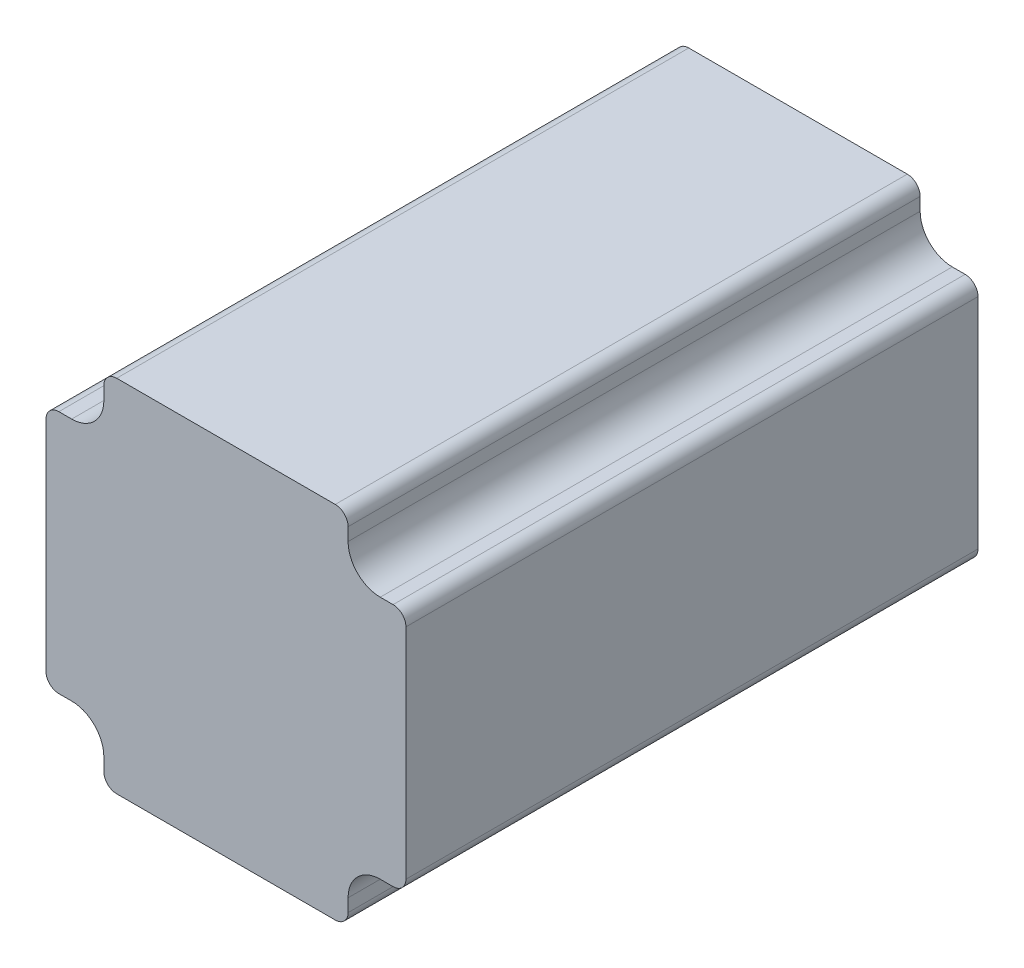
ISO-10303-21;
HEADER;
FILE_DESCRIPTION(('STEP AP214'),'2;1');
FILE_NAME('part.step','',(''),(''),'','','');
FILE_SCHEMA(('AUTOMOTIVE_DESIGN { 1 0 10303 214 1 1 1 1 }'));
ENDSEC;
DATA;
#1=APPLICATION_CONTEXT('core data for automotive mechanical design processes');
#2=APPLICATION_PROTOCOL_DEFINITION('international standard','automotive_design',2000,#1);
#3=PRODUCT_CONTEXT('',#1,'mechanical');
#4=PRODUCT('Part','Part','',(#3));
#5=PRODUCT_RELATED_PRODUCT_CATEGORY('part','',(#4));
#6=PRODUCT_DEFINITION_FORMATION('','',#4);
#7=PRODUCT_DEFINITION_CONTEXT('part definition',#1,'design');
#8=PRODUCT_DEFINITION('design','',#6,#7);
#9=PRODUCT_DEFINITION_SHAPE('','',#8);
#10=(LENGTH_UNIT() NAMED_UNIT(*) SI_UNIT(.MILLI.,.METRE.));
#11=(NAMED_UNIT(*) PLANE_ANGLE_UNIT() SI_UNIT($,.RADIAN.));
#12=(NAMED_UNIT(*) SI_UNIT($,.STERADIAN.) SOLID_ANGLE_UNIT());
#13=UNCERTAINTY_MEASURE_WITH_UNIT(LENGTH_MEASURE(1.E-05),#10,'distance_accuracy_value','');
#14=(GEOMETRIC_REPRESENTATION_CONTEXT(3) GLOBAL_UNCERTAINTY_ASSIGNED_CONTEXT((#13)) GLOBAL_UNIT_ASSIGNED_CONTEXT((#10,
#11,#12)) REPRESENTATION_CONTEXT('',''));
#15=CARTESIAN_POINT('',(0.,0.,0.));
#16=DIRECTION('',(0.,0.,1.));
#17=DIRECTION('',(1.,0.,0.));
#18=AXIS2_PLACEMENT_3D('',#15,#16,#17);
#19=CARTESIAN_POINT('',(-28.,-28.,89.));
#20=DIRECTION('',(1.,0.,0.));
#21=DIRECTION('',(0.,0.,-1.));
#22=AXIS2_PLACEMENT_3D('',#19,#20,#21);
#23=PLANE('',#22);
#24=DIRECTION('',(0.,-1.,0.));
#25=VECTOR('',#24,1.);
#26=CARTESIAN_POINT('',(-28.,-28.,0.));
#27=LINE('',#26,#25);
#28=CARTESIAN_POINT('',(-28.,16.9999999999999,0.));
#29=VERTEX_POINT('',#28);
#30=CARTESIAN_POINT('',(-28.,-17.,0.));
#31=VERTEX_POINT('',#30);
#32=EDGE_CURVE('E237',#29,#31,#27,.T.);
#33=ORIENTED_EDGE('',*,*,#32,.T.);
#34=DIRECTION('',(0.,0.,1.));
#35=VECTOR('',#34,1.);
#36=CARTESIAN_POINT('',(-28.,-17.,89.));
#37=LINE('',#36,#35);
#38=CARTESIAN_POINT('',(-28.,-17.,89.));
#39=VERTEX_POINT('',#38);
#40=EDGE_CURVE('E355',#31,#39,#37,.T.);
#41=ORIENTED_EDGE('',*,*,#40,.T.);
#42=DIRECTION('',(0.,-1.,0.));
#43=VECTOR('',#42,1.);
#44=CARTESIAN_POINT('',(-28.,-28.,89.));
#45=LINE('',#44,#43);
#46=CARTESIAN_POINT('',(-28.,16.9999999999999,89.));
#47=VERTEX_POINT('',#46);
#48=EDGE_CURVE('E242',#47,#39,#45,.T.);
#49=ORIENTED_EDGE('',*,*,#48,.F.);
#50=DIRECTION('',(0.,0.,1.));
#51=VECTOR('',#50,1.);
#52=CARTESIAN_POINT('',(-28.,16.9999999999999,89.));
#53=LINE('',#52,#51);
#54=EDGE_CURVE('E353',#47,#29,#53,.F.);
#55=ORIENTED_EDGE('',*,*,#54,.T.);
#56=EDGE_LOOP('',(#33,#41,#49,#55));
#57=FACE_BOUND('',#56,.T.);
#58=ADVANCED_FACE('F33',(#57),#23,.F.);
#59=CARTESIAN_POINT('',(28.,-28.,89.));
#60=DIRECTION('',(0.,1.,0.));
#61=DIRECTION('',(-1.,0.,0.));
#62=AXIS2_PLACEMENT_3D('',#59,#60,#61);
#63=PLANE('',#62);
#64=DIRECTION('',(1.,0.,0.));
#65=VECTOR('',#64,1.);
#66=CARTESIAN_POINT('',(28.,-28.,0.));
#67=LINE('',#66,#65);
#68=CARTESIAN_POINT('',(-17.,-28.,0.));
#69=VERTEX_POINT('',#68);
#70=CARTESIAN_POINT('',(17.0000000000003,-28.,0.));
#71=VERTEX_POINT('',#70);
#72=EDGE_CURVE('E255',#69,#71,#67,.T.);
#73=ORIENTED_EDGE('',*,*,#72,.T.);
#74=DIRECTION('',(0.,0.,1.));
#75=VECTOR('',#74,1.);
#76=CARTESIAN_POINT('',(17.0000000000003,-28.,89.));
#77=LINE('',#76,#75);
#78=CARTESIAN_POINT('',(17.0000000000003,-28.,89.));
#79=VERTEX_POINT('',#78);
#80=EDGE_CURVE('E345',#71,#79,#77,.T.);
#81=ORIENTED_EDGE('',*,*,#80,.T.);
#82=DIRECTION('',(1.,0.,0.));
#83=VECTOR('',#82,1.);
#84=CARTESIAN_POINT('',(28.,-28.,89.));
#85=LINE('',#84,#83);
#86=CARTESIAN_POINT('',(-17.,-28.,89.));
#87=VERTEX_POINT('',#86);
#88=EDGE_CURVE('E245',#87,#79,#85,.T.);
#89=ORIENTED_EDGE('',*,*,#88,.F.);
#90=DIRECTION('',(0.,0.,1.));
#91=VECTOR('',#90,1.);
#92=CARTESIAN_POINT('',(-17.,-28.,89.));
#93=LINE('',#92,#91);
#94=EDGE_CURVE('E55',#87,#69,#93,.F.);
#95=ORIENTED_EDGE('',*,*,#94,.T.);
#96=EDGE_LOOP('',(#73,#81,#89,#95));
#97=FACE_BOUND('',#96,.T.);
#98=ADVANCED_FACE('F455',(#97),#63,.F.);
#99=CARTESIAN_POINT('',(28.,-28.,89.));
#100=DIRECTION('',(-1.,0.,0.));
#101=DIRECTION('',(0.,0.,1.));
#102=AXIS2_PLACEMENT_3D('',#99,#100,#101);
#103=PLANE('',#102);
#104=DIRECTION('',(0.,1.,0.));
#105=VECTOR('',#104,1.);
#106=CARTESIAN_POINT('',(28.,-28.,0.));
#107=LINE('',#106,#105);
#108=CARTESIAN_POINT('',(28.,-16.9999999999997,0.));
#109=VERTEX_POINT('',#108);
#110=CARTESIAN_POINT('',(28.,17.,0.));
#111=VERTEX_POINT('',#110);
#112=EDGE_CURVE('E257',#109,#111,#107,.T.);
#113=ORIENTED_EDGE('',*,*,#112,.T.);
#114=DIRECTION('',(0.,0.,1.));
#115=VECTOR('',#114,1.);
#116=CARTESIAN_POINT('',(28.,17.,89.));
#117=LINE('',#116,#115);
#118=CARTESIAN_POINT('',(28.,17.,89.));
#119=VERTEX_POINT('',#118);
#120=EDGE_CURVE('E336',#111,#119,#117,.T.);
#121=ORIENTED_EDGE('',*,*,#120,.T.);
#122=DIRECTION('',(0.,1.,0.));
#123=VECTOR('',#122,1.);
#124=CARTESIAN_POINT('',(28.,-28.,89.));
#125=LINE('',#124,#123);
#126=CARTESIAN_POINT('',(28.,-16.9999999999997,89.));
#127=VERTEX_POINT('',#126);
#128=EDGE_CURVE('E249',#127,#119,#125,.T.);
#129=ORIENTED_EDGE('',*,*,#128,.F.);
#130=DIRECTION('',(0.,0.,1.));
#131=VECTOR('',#130,1.);
#132=CARTESIAN_POINT('',(28.,-16.9999999999997,89.));
#133=LINE('',#132,#131);
#134=EDGE_CURVE('E334',#127,#109,#133,.F.);
#135=ORIENTED_EDGE('',*,*,#134,.T.);
#136=EDGE_LOOP('',(#113,#121,#129,#135));
#137=FACE_BOUND('',#136,.T.);
#138=ADVANCED_FACE('F432',(#137),#103,.F.);
#139=CARTESIAN_POINT('',(28.,28.,89.));
#140=DIRECTION('',(0.,-1.,0.));
#141=DIRECTION('',(1.,0.,0.));
#142=AXIS2_PLACEMENT_3D('',#139,#140,#141);
#143=PLANE('',#142);
#144=DIRECTION('',(-1.,0.,0.));
#145=VECTOR('',#144,1.);
#146=CARTESIAN_POINT('',(28.,28.,89.));
#147=LINE('',#146,#145);
#148=CARTESIAN_POINT('',(17.,28.,89.));
#149=VERTEX_POINT('',#148);
#150=CARTESIAN_POINT('',(-17.0000000000001,28.,89.));
#151=VERTEX_POINT('',#150);
#152=EDGE_CURVE('E217',#149,#151,#147,.T.);
#153=ORIENTED_EDGE('',*,*,#152,.F.);
#154=DIRECTION('',(0.,0.,1.));
#155=VECTOR('',#154,1.);
#156=CARTESIAN_POINT('',(17.,28.,89.));
#157=LINE('',#156,#155);
#158=CARTESIAN_POINT('',(17.,28.,0.));
#159=VERTEX_POINT('',#158);
#160=EDGE_CURVE('E317',#149,#159,#157,.F.);
#161=ORIENTED_EDGE('',*,*,#160,.T.);
#162=DIRECTION('',(-1.,0.,0.));
#163=VECTOR('',#162,1.);
#164=CARTESIAN_POINT('',(28.,28.,0.));
#165=LINE('',#164,#163);
#166=CARTESIAN_POINT('',(-17.0000000000001,28.,0.));
#167=VERTEX_POINT('',#166);
#168=EDGE_CURVE('E246',#159,#167,#165,.T.);
#169=ORIENTED_EDGE('',*,*,#168,.T.);
#170=DIRECTION('',(0.,0.,1.));
#171=VECTOR('',#170,1.);
#172=CARTESIAN_POINT('',(-17.0000000000001,28.,89.));
#173=LINE('',#172,#171);
#174=EDGE_CURVE('E314',#167,#151,#173,.T.);
#175=ORIENTED_EDGE('',*,*,#174,.T.);
#176=EDGE_LOOP('',(#153,#161,#169,#175));
#177=FACE_BOUND('',#176,.T.);
#178=ADVANCED_FACE('F406',(#177),#143,.F.);
#179=CARTESIAN_POINT('',(0.,0.,89.));
#180=DIRECTION('',(0.,0.,1.));
#181=DIRECTION('',(1.,0.,0.));
#182=AXIS2_PLACEMENT_3D('',#179,#180,#181);
#183=PLANE('',#182);
#184=DIRECTION('',(0.,-1.,0.));
#185=VECTOR('',#184,1.);
#186=CARTESIAN_POINT('',(19.,28.,89.));
#187=LINE('',#186,#185);
#188=CARTESIAN_POINT('',(19.,26.,89.));
#189=VERTEX_POINT('',#188);
#190=CARTESIAN_POINT('',(19.,24.,89.));
#191=VERTEX_POINT('',#190);
#192=EDGE_CURVE('E238',#189,#191,#187,.T.);
#193=ORIENTED_EDGE('',*,*,#192,.F.);
#194=CARTESIAN_POINT('',(17.,26.,89.));
#195=DIRECTION('',(0.,0.,1.));
#196=DIRECTION('',(1.,0.,0.));
#197=AXIS2_PLACEMENT_3D('',#194,#195,#196);
#198=CIRCLE('',#197,2.);
#199=EDGE_CURVE('E312',#189,#149,#198,.T.);
#200=ORIENTED_EDGE('',*,*,#199,.T.);
#201=ORIENTED_EDGE('',*,*,#152,.T.);
#202=CARTESIAN_POINT('',(-17.0000000000001,26.,89.));
#203=DIRECTION('',(0.,0.,1.));
#204=DIRECTION('',(1.,0.,0.));
#205=AXIS2_PLACEMENT_3D('',#202,#203,#204);
#206=CIRCLE('',#205,2.);
#207=CARTESIAN_POINT('',(-19.0000000000001,26.,89.));
#208=VERTEX_POINT('',#207);
#209=EDGE_CURVE('E222',#151,#208,#206,.T.);
#210=ORIENTED_EDGE('',*,*,#209,.T.);
#211=DIRECTION('',(0.,1.,0.));
#212=VECTOR('',#211,1.);
#213=CARTESIAN_POINT('',(-19.0000000000001,18.9999999999999,89.));
#214=LINE('',#213,#212);
#215=CARTESIAN_POINT('',(-19.0000000000001,23.9999999999999,89.));
#216=VERTEX_POINT('',#215);
#217=EDGE_CURVE('E213',#216,#208,#214,.T.);
#218=ORIENTED_EDGE('',*,*,#217,.F.);
#219=CARTESIAN_POINT('',(-24.0000000000001,23.9999999999999,89.));
#220=DIRECTION('',(0.,0.,1.));
#221=DIRECTION('',(1.,0.,0.));
#222=AXIS2_PLACEMENT_3D('',#219,#220,#221);
#223=CIRCLE('',#222,5.);
#224=CARTESIAN_POINT('',(-24.0000000000001,18.9999999999999,89.));
#225=VERTEX_POINT('',#224);
#226=EDGE_CURVE('E196',#216,#225,#223,.F.);
#227=ORIENTED_EDGE('',*,*,#226,.T.);
#228=DIRECTION('',(1.,0.,0.));
#229=VECTOR('',#228,1.);
#230=CARTESIAN_POINT('',(-28.0000000000001,18.9999999999999,89.));
#231=LINE('',#230,#229);
#232=CARTESIAN_POINT('',(-26.,18.9999999999999,89.));
#233=VERTEX_POINT('',#232);
#234=EDGE_CURVE('E224',#233,#225,#231,.T.);
#235=ORIENTED_EDGE('',*,*,#234,.F.);
#236=CARTESIAN_POINT('',(-26.,16.9999999999999,89.));
#237=DIRECTION('',(0.,0.,1.));
#238=DIRECTION('',(1.,0.,0.));
#239=AXIS2_PLACEMENT_3D('',#236,#237,#238);
#240=CIRCLE('',#239,2.);
#241=EDGE_CURVE('E300',#233,#47,#240,.T.);
#242=ORIENTED_EDGE('',*,*,#241,.T.);
#243=ORIENTED_EDGE('',*,*,#48,.T.);
#244=CARTESIAN_POINT('',(-26.,-17.,89.));
#245=DIRECTION('',(0.,0.,1.));
#246=DIRECTION('',(1.,0.,0.));
#247=AXIS2_PLACEMENT_3D('',#244,#245,#246);
#248=CIRCLE('',#247,2.);
#249=CARTESIAN_POINT('',(-26.,-19.,89.));
#250=VERTEX_POINT('',#249);
#251=EDGE_CURVE('E302',#39,#250,#248,.T.);
#252=ORIENTED_EDGE('',*,*,#251,.T.);
#253=DIRECTION('',(-1.,0.,0.));
#254=VECTOR('',#253,1.);
#255=CARTESIAN_POINT('',(-19.,-19.,89.));
#256=LINE('',#255,#254);
#257=CARTESIAN_POINT('',(-24.,-19.,89.));
#258=VERTEX_POINT('',#257);
#259=EDGE_CURVE('E381',#258,#250,#256,.T.);
#260=ORIENTED_EDGE('',*,*,#259,.F.);
#261=CARTESIAN_POINT('',(-24.,-24.,89.));
#262=DIRECTION('',(0.,0.,1.));
#263=DIRECTION('',(1.,0.,0.));
#264=AXIS2_PLACEMENT_3D('',#261,#262,#263);
#265=CIRCLE('',#264,5.);
#266=CARTESIAN_POINT('',(-19.,-24.,89.));
#267=VERTEX_POINT('',#266);
#268=EDGE_CURVE('E281',#258,#267,#265,.F.);
#269=ORIENTED_EDGE('',*,*,#268,.T.);
#270=DIRECTION('',(0.,1.,0.));
#271=VECTOR('',#270,1.);
#272=CARTESIAN_POINT('',(-19.,-28.,89.));
#273=LINE('',#272,#271);
#274=CARTESIAN_POINT('',(-19.,-26.,89.));
#275=VERTEX_POINT('',#274);
#276=EDGE_CURVE('E387',#275,#267,#273,.T.);
#277=ORIENTED_EDGE('',*,*,#276,.F.);
#278=CARTESIAN_POINT('',(-17.,-26.,89.));
#279=DIRECTION('',(0.,0.,1.));
#280=DIRECTION('',(1.,0.,0.));
#281=AXIS2_PLACEMENT_3D('',#278,#279,#280);
#282=CIRCLE('',#281,2.);
#283=EDGE_CURVE('E304',#275,#87,#282,.T.);
#284=ORIENTED_EDGE('',*,*,#283,.T.);
#285=ORIENTED_EDGE('',*,*,#88,.T.);
#286=CARTESIAN_POINT('',(17.0000000000003,-26.,89.));
#287=DIRECTION('',(0.,0.,1.));
#288=DIRECTION('',(1.,0.,0.));
#289=AXIS2_PLACEMENT_3D('',#286,#287,#288);
#290=CIRCLE('',#289,2.);
#291=CARTESIAN_POINT('',(19.0000000000003,-26.,89.));
#292=VERTEX_POINT('',#291);
#293=EDGE_CURVE('E306',#79,#292,#290,.T.);
#294=ORIENTED_EDGE('',*,*,#293,.T.);
#295=DIRECTION('',(0.,-1.,0.));
#296=VECTOR('',#295,1.);
#297=CARTESIAN_POINT('',(19.0000000000002,-18.9999999999998,89.));
#298=LINE('',#297,#296);
#299=CARTESIAN_POINT('',(19.0000000000003,-23.9999999999998,89.));
#300=VERTEX_POINT('',#299);
#301=EDGE_CURVE('E396',#300,#292,#298,.T.);
#302=ORIENTED_EDGE('',*,*,#301,.F.);
#303=CARTESIAN_POINT('',(24.0000000000003,-23.9999999999997,89.));
#304=DIRECTION('',(0.,0.,1.));
#305=DIRECTION('',(1.,0.,0.));
#306=AXIS2_PLACEMENT_3D('',#303,#304,#305);
#307=CIRCLE('',#306,5.);
#308=CARTESIAN_POINT('',(24.0000000000002,-18.9999999999997,89.));
#309=VERTEX_POINT('',#308);
#310=EDGE_CURVE('E286',#300,#309,#307,.F.);
#311=ORIENTED_EDGE('',*,*,#310,.T.);
#312=DIRECTION('',(-1.,0.,0.));
#313=VECTOR('',#312,1.);
#314=CARTESIAN_POINT('',(28.0000000000002,-18.9999999999997,89.));
#315=LINE('',#314,#313);
#316=CARTESIAN_POINT('',(26.,-18.9999999999997,89.));
#317=VERTEX_POINT('',#316);
#318=EDGE_CURVE('E398',#317,#309,#315,.T.);
#319=ORIENTED_EDGE('',*,*,#318,.F.);
#320=CARTESIAN_POINT('',(26.,-16.9999999999997,89.));
#321=DIRECTION('',(0.,0.,1.));
#322=DIRECTION('',(1.,0.,0.));
#323=AXIS2_PLACEMENT_3D('',#320,#321,#322);
#324=CIRCLE('',#323,2.);
#325=EDGE_CURVE('E308',#317,#127,#324,.T.);
#326=ORIENTED_EDGE('',*,*,#325,.T.);
#327=ORIENTED_EDGE('',*,*,#128,.T.);
#328=CARTESIAN_POINT('',(26.,17.,89.));
#329=DIRECTION('',(0.,0.,1.));
#330=DIRECTION('',(1.,0.,0.));
#331=AXIS2_PLACEMENT_3D('',#328,#329,#330);
#332=CIRCLE('',#331,2.);
#333=CARTESIAN_POINT('',(26.,19.,89.));
#334=VERTEX_POINT('',#333);
#335=EDGE_CURVE('E310',#119,#334,#332,.T.);
#336=ORIENTED_EDGE('',*,*,#335,.T.);
#337=DIRECTION('',(1.,0.,0.));
#338=VECTOR('',#337,1.);
#339=CARTESIAN_POINT('',(19.,19.,89.));
#340=LINE('',#339,#338);
#341=CARTESIAN_POINT('',(24.,19.,89.));
#342=VERTEX_POINT('',#341);
#343=EDGE_CURVE('E234',#342,#334,#340,.T.);
#344=ORIENTED_EDGE('',*,*,#343,.F.);
#345=CARTESIAN_POINT('',(24.,24.,89.));
#346=DIRECTION('',(0.,0.,1.));
#347=DIRECTION('',(1.,0.,0.));
#348=AXIS2_PLACEMENT_3D('',#345,#346,#347);
#349=CIRCLE('',#348,5.);
#350=EDGE_CURVE('E291',#342,#191,#349,.F.);
#351=ORIENTED_EDGE('',*,*,#350,.T.);
#352=EDGE_LOOP('',(#193,#200,#201,#210,#218,#227,#235,#242,#243,#252,#260,#269,#277,#284,#285,
#294,#302,#311,#319,#326,#327,#336,#344,#351));
#353=FACE_BOUND('',#352,.T.);
#354=ADVANCED_FACE('F220',(#353),#183,.T.);
#355=CARTESIAN_POINT('',(0.,0.,0.));
#356=DIRECTION('',(0.,0.,1.));
#357=DIRECTION('',(1.,0.,0.));
#358=AXIS2_PLACEMENT_3D('',#355,#356,#357);
#359=PLANE('',#358);
#360=ORIENTED_EDGE('',*,*,#168,.F.);
#361=CARTESIAN_POINT('',(17.,26.,0.));
#362=DIRECTION('',(0.,0.,1.));
#363=DIRECTION('',(1.,0.,0.));
#364=AXIS2_PLACEMENT_3D('',#361,#362,#363);
#365=CIRCLE('',#364,2.);
#366=CARTESIAN_POINT('',(19.,26.,0.));
#367=VERTEX_POINT('',#366);
#368=EDGE_CURVE('E332',#159,#367,#365,.F.);
#369=ORIENTED_EDGE('',*,*,#368,.T.);
#370=DIRECTION('',(0.,-1.,0.));
#371=VECTOR('',#370,1.);
#372=CARTESIAN_POINT('',(19.,28.,0.));
#373=LINE('',#372,#371);
#374=CARTESIAN_POINT('',(19.,24.,0.));
#375=VERTEX_POINT('',#374);
#376=EDGE_CURVE('E231',#367,#375,#373,.T.);
#377=ORIENTED_EDGE('',*,*,#376,.T.);
#378=CARTESIAN_POINT('',(24.,24.,0.));
#379=DIRECTION('',(0.,0.,1.));
#380=DIRECTION('',(1.,0.,0.));
#381=AXIS2_PLACEMENT_3D('',#378,#379,#380);
#382=CIRCLE('',#381,5.);
#383=CARTESIAN_POINT('',(24.,19.,0.));
#384=VERTEX_POINT('',#383);
#385=EDGE_CURVE('E294',#375,#384,#382,.T.);
#386=ORIENTED_EDGE('',*,*,#385,.T.);
#387=DIRECTION('',(1.,0.,0.));
#388=VECTOR('',#387,1.);
#389=CARTESIAN_POINT('',(19.,19.,0.));
#390=LINE('',#389,#388);
#391=CARTESIAN_POINT('',(26.,19.,0.));
#392=VERTEX_POINT('',#391);
#393=EDGE_CURVE('E233',#384,#392,#390,.T.);
#394=ORIENTED_EDGE('',*,*,#393,.T.);
#395=CARTESIAN_POINT('',(26.,17.,0.));
#396=DIRECTION('',(0.,0.,1.));
#397=DIRECTION('',(1.,0.,0.));
#398=AXIS2_PLACEMENT_3D('',#395,#396,#397);
#399=CIRCLE('',#398,2.);
#400=EDGE_CURVE('E330',#392,#111,#399,.F.);
#401=ORIENTED_EDGE('',*,*,#400,.T.);
#402=ORIENTED_EDGE('',*,*,#112,.F.);
#403=CARTESIAN_POINT('',(26.,-16.9999999999997,0.));
#404=DIRECTION('',(0.,0.,1.));
#405=DIRECTION('',(1.,0.,0.));
#406=AXIS2_PLACEMENT_3D('',#403,#404,#405);
#407=CIRCLE('',#406,2.);
#408=CARTESIAN_POINT('',(26.,-18.9999999999997,0.));
#409=VERTEX_POINT('',#408);
#410=EDGE_CURVE('E328',#109,#409,#407,.F.);
#411=ORIENTED_EDGE('',*,*,#410,.T.);
#412=DIRECTION('',(-1.,0.,0.));
#413=VECTOR('',#412,1.);
#414=CARTESIAN_POINT('',(28.0000000000002,-18.9999999999997,0.));
#415=LINE('',#414,#413);
#416=CARTESIAN_POINT('',(24.0000000000002,-18.9999999999997,0.));
#417=VERTEX_POINT('',#416);
#418=EDGE_CURVE('E394',#409,#417,#415,.T.);
#419=ORIENTED_EDGE('',*,*,#418,.T.);
#420=CARTESIAN_POINT('',(24.0000000000003,-23.9999999999997,0.));
#421=DIRECTION('',(0.,0.,1.));
#422=DIRECTION('',(1.,0.,0.));
#423=AXIS2_PLACEMENT_3D('',#420,#421,#422);
#424=CIRCLE('',#423,5.);
#425=CARTESIAN_POINT('',(19.0000000000003,-23.9999999999998,0.));
#426=VERTEX_POINT('',#425);
#427=EDGE_CURVE('E289',#417,#426,#424,.T.);
#428=ORIENTED_EDGE('',*,*,#427,.T.);
#429=DIRECTION('',(0.,-1.,0.));
#430=VECTOR('',#429,1.);
#431=CARTESIAN_POINT('',(19.0000000000002,-18.9999999999998,0.));
#432=LINE('',#431,#430);
#433=CARTESIAN_POINT('',(19.0000000000003,-26.,0.));
#434=VERTEX_POINT('',#433);
#435=EDGE_CURVE('E390',#426,#434,#432,.T.);
#436=ORIENTED_EDGE('',*,*,#435,.T.);
#437=CARTESIAN_POINT('',(17.0000000000003,-26.,0.));
#438=DIRECTION('',(0.,0.,1.));
#439=DIRECTION('',(1.,0.,0.));
#440=AXIS2_PLACEMENT_3D('',#437,#438,#439);
#441=CIRCLE('',#440,2.);
#442=EDGE_CURVE('E48',#434,#71,#441,.F.);
#443=ORIENTED_EDGE('',*,*,#442,.T.);
#444=ORIENTED_EDGE('',*,*,#72,.F.);
#445=CARTESIAN_POINT('',(-17.,-26.,0.));
#446=DIRECTION('',(0.,0.,1.));
#447=DIRECTION('',(1.,0.,0.));
#448=AXIS2_PLACEMENT_3D('',#445,#446,#447);
#449=CIRCLE('',#448,2.);
#450=CARTESIAN_POINT('',(-19.,-26.,0.));
#451=VERTEX_POINT('',#450);
#452=EDGE_CURVE('E325',#69,#451,#449,.F.);
#453=ORIENTED_EDGE('',*,*,#452,.T.);
#454=DIRECTION('',(0.,1.,0.));
#455=VECTOR('',#454,1.);
#456=CARTESIAN_POINT('',(-19.,-28.,0.));
#457=LINE('',#456,#455);
#458=CARTESIAN_POINT('',(-19.,-24.,0.));
#459=VERTEX_POINT('',#458);
#460=EDGE_CURVE('E386',#451,#459,#457,.T.);
#461=ORIENTED_EDGE('',*,*,#460,.T.);
#462=CARTESIAN_POINT('',(-24.,-24.,0.));
#463=DIRECTION('',(0.,0.,1.));
#464=DIRECTION('',(1.,0.,0.));
#465=AXIS2_PLACEMENT_3D('',#462,#463,#464);
#466=CIRCLE('',#465,5.);
#467=CARTESIAN_POINT('',(-24.,-19.,0.));
#468=VERTEX_POINT('',#467);
#469=EDGE_CURVE('E284',#459,#468,#466,.T.);
#470=ORIENTED_EDGE('',*,*,#469,.T.);
#471=DIRECTION('',(-1.,0.,0.));
#472=VECTOR('',#471,1.);
#473=CARTESIAN_POINT('',(-19.,-19.,0.));
#474=LINE('',#473,#472);
#475=CARTESIAN_POINT('',(-26.,-19.,0.));
#476=VERTEX_POINT('',#475);
#477=EDGE_CURVE('E227',#468,#476,#474,.T.);
#478=ORIENTED_EDGE('',*,*,#477,.T.);
#479=CARTESIAN_POINT('',(-26.,-17.,0.));
#480=DIRECTION('',(0.,0.,1.));
#481=DIRECTION('',(1.,0.,0.));
#482=AXIS2_PLACEMENT_3D('',#479,#480,#481);
#483=CIRCLE('',#482,2.);
#484=EDGE_CURVE('E323',#476,#31,#483,.F.);
#485=ORIENTED_EDGE('',*,*,#484,.T.);
#486=ORIENTED_EDGE('',*,*,#32,.F.);
#487=CARTESIAN_POINT('',(-26.,16.9999999999999,0.));
#488=DIRECTION('',(0.,0.,1.));
#489=DIRECTION('',(1.,0.,0.));
#490=AXIS2_PLACEMENT_3D('',#487,#488,#489);
#491=CIRCLE('',#490,2.);
#492=CARTESIAN_POINT('',(-26.,18.9999999999999,0.));
#493=VERTEX_POINT('',#492);
#494=EDGE_CURVE('E321',#29,#493,#491,.F.);
#495=ORIENTED_EDGE('',*,*,#494,.T.);
#496=DIRECTION('',(1.,0.,0.));
#497=VECTOR('',#496,1.);
#498=CARTESIAN_POINT('',(-28.0000000000001,18.9999999999999,0.));
#499=LINE('',#498,#497);
#500=CARTESIAN_POINT('',(-24.0000000000001,18.9999999999999,0.));
#501=VERTEX_POINT('',#500);
#502=EDGE_CURVE('E223',#493,#501,#499,.T.);
#503=ORIENTED_EDGE('',*,*,#502,.T.);
#504=CARTESIAN_POINT('',(-24.0000000000001,23.9999999999999,0.));
#505=DIRECTION('',(0.,0.,1.));
#506=DIRECTION('',(1.,0.,0.));
#507=AXIS2_PLACEMENT_3D('',#504,#505,#506);
#508=CIRCLE('',#507,5.);
#509=CARTESIAN_POINT('',(-19.0000000000001,23.9999999999999,0.));
#510=VERTEX_POINT('',#509);
#511=EDGE_CURVE('E206',#501,#510,#508,.T.);
#512=ORIENTED_EDGE('',*,*,#511,.T.);
#513=DIRECTION('',(0.,1.,0.));
#514=VECTOR('',#513,1.);
#515=CARTESIAN_POINT('',(-19.0000000000001,18.9999999999999,0.));
#516=LINE('',#515,#514);
#517=CARTESIAN_POINT('',(-19.0000000000001,26.,0.));
#518=VERTEX_POINT('',#517);
#519=EDGE_CURVE('E216',#510,#518,#516,.T.);
#520=ORIENTED_EDGE('',*,*,#519,.T.);
#521=CARTESIAN_POINT('',(-17.0000000000001,26.,0.));
#522=DIRECTION('',(0.,0.,1.));
#523=DIRECTION('',(1.,0.,0.));
#524=AXIS2_PLACEMENT_3D('',#521,#522,#523);
#525=CIRCLE('',#524,2.);
#526=EDGE_CURVE('E319',#518,#167,#525,.F.);
#527=ORIENTED_EDGE('',*,*,#526,.T.);
#528=EDGE_LOOP('',(#360,#369,#377,#386,#394,#401,#402,#411,#419,#428,#436,#443,#444,#453,#461,
#470,#478,#485,#486,#495,#503,#512,#520,#527));
#529=FACE_BOUND('',#528,.T.);
#530=ADVANCED_FACE('F373',(#529),#359,.F.);
#531=CARTESIAN_POINT('',(19.,19.,0.));
#532=DIRECTION('',(0.,-1.,0.));
#533=DIRECTION('',(0.,0.,-1.));
#534=AXIS2_PLACEMENT_3D('',#531,#532,#533);
#535=PLANE('',#534);
#536=ORIENTED_EDGE('',*,*,#343,.T.);
#537=DIRECTION('',(0.,0.,1.));
#538=VECTOR('',#537,1.);
#539=CARTESIAN_POINT('',(26.,19.,0.));
#540=LINE('',#539,#538);
#541=EDGE_CURVE('E339',#334,#392,#540,.F.);
#542=ORIENTED_EDGE('',*,*,#541,.T.);
#543=ORIENTED_EDGE('',*,*,#393,.F.);
#544=DIRECTION('',(0.,0.,1.));
#545=VECTOR('',#544,1.);
#546=CARTESIAN_POINT('',(24.,19.,89.));
#547=LINE('',#546,#545);
#548=EDGE_CURVE('E275',#384,#342,#547,.T.);
#549=ORIENTED_EDGE('',*,*,#548,.T.);
#550=EDGE_LOOP('',(#536,#542,#543,#549));
#551=FACE_BOUND('',#550,.T.);
#552=ADVANCED_FACE('F422',(#551),#535,.F.);
#553=CARTESIAN_POINT('',(19.,28.,0.));
#554=DIRECTION('',(-1.,0.,0.));
#555=DIRECTION('',(0.,0.,1.));
#556=AXIS2_PLACEMENT_3D('',#553,#554,#555);
#557=PLANE('',#556);
#558=ORIENTED_EDGE('',*,*,#376,.F.);
#559=DIRECTION('',(0.,0.,1.));
#560=VECTOR('',#559,1.);
#561=CARTESIAN_POINT('',(19.,26.,0.));
#562=LINE('',#561,#560);
#563=EDGE_CURVE('E296',#367,#189,#562,.T.);
#564=ORIENTED_EDGE('',*,*,#563,.T.);
#565=ORIENTED_EDGE('',*,*,#192,.T.);
#566=DIRECTION('',(0.,0.,1.));
#567=VECTOR('',#566,1.);
#568=CARTESIAN_POINT('',(19.,24.,0.));
#569=LINE('',#568,#567);
#570=EDGE_CURVE('E207',#191,#375,#569,.F.);
#571=ORIENTED_EDGE('',*,*,#570,.T.);
#572=EDGE_LOOP('',(#558,#564,#565,#571));
#573=FACE_BOUND('',#572,.T.);
#574=ADVANCED_FACE('F414',(#573),#557,.F.);
#575=CARTESIAN_POINT('',(-19.0000000000001,18.9999999999999,0.));
#576=DIRECTION('',(1.,0.,0.));
#577=DIRECTION('',(0.,1.,0.));
#578=AXIS2_PLACEMENT_3D('',#575,#576,#577);
#579=PLANE('',#578);
#580=ORIENTED_EDGE('',*,*,#217,.T.);
#581=DIRECTION('',(0.,0.,1.));
#582=VECTOR('',#581,1.);
#583=CARTESIAN_POINT('',(-19.0000000000001,26.,0.));
#584=LINE('',#583,#582);
#585=EDGE_CURVE('E11',#208,#518,#584,.F.);
#586=ORIENTED_EDGE('',*,*,#585,.T.);
#587=ORIENTED_EDGE('',*,*,#519,.F.);
#588=DIRECTION('',(0.,0.,1.));
#589=VECTOR('',#588,1.);
#590=CARTESIAN_POINT('',(-19.0000000000001,23.9999999999999,89.));
#591=LINE('',#590,#589);
#592=EDGE_CURVE('E200',#510,#216,#591,.T.);
#593=ORIENTED_EDGE('',*,*,#592,.T.);
#594=EDGE_LOOP('',(#580,#586,#587,#593));
#595=FACE_BOUND('',#594,.T.);
#596=ADVANCED_FACE('F212',(#595),#579,.F.);
#597=CARTESIAN_POINT('',(-28.0000000000001,18.9999999999999,0.));
#598=DIRECTION('',(0.,-1.,0.));
#599=DIRECTION('',(1.,0.,0.));
#600=AXIS2_PLACEMENT_3D('',#597,#598,#599);
#601=PLANE('',#600);
#602=ORIENTED_EDGE('',*,*,#502,.F.);
#603=DIRECTION('',(0.,0.,1.));
#604=VECTOR('',#603,1.);
#605=CARTESIAN_POINT('',(-26.,18.9999999999999,0.));
#606=LINE('',#605,#604);
#607=EDGE_CURVE('E41',#493,#233,#606,.T.);
#608=ORIENTED_EDGE('',*,*,#607,.T.);
#609=ORIENTED_EDGE('',*,*,#234,.T.);
#610=DIRECTION('',(0.,0.,1.));
#611=VECTOR('',#610,1.);
#612=CARTESIAN_POINT('',(-24.0000000000001,18.9999999999999,0.));
#613=LINE('',#612,#611);
#614=EDGE_CURVE('E202',#225,#501,#613,.F.);
#615=ORIENTED_EDGE('',*,*,#614,.T.);
#616=EDGE_LOOP('',(#602,#608,#609,#615));
#617=FACE_BOUND('',#616,.T.);
#618=ADVANCED_FACE('F363',(#617),#601,.F.);
#619=CARTESIAN_POINT('',(19.0000000000002,-18.9999999999998,0.));
#620=DIRECTION('',(-1.,0.,0.));
#621=DIRECTION('',(0.,-1.,0.));
#622=AXIS2_PLACEMENT_3D('',#619,#620,#621);
#623=PLANE('',#622);
#624=ORIENTED_EDGE('',*,*,#301,.T.);
#625=DIRECTION('',(0.,0.,1.));
#626=VECTOR('',#625,1.);
#627=CARTESIAN_POINT('',(19.0000000000003,-26.,0.));
#628=LINE('',#627,#626);
#629=EDGE_CURVE('E348',#292,#434,#628,.F.);
#630=ORIENTED_EDGE('',*,*,#629,.T.);
#631=ORIENTED_EDGE('',*,*,#435,.F.);
#632=DIRECTION('',(0.,0.,1.));
#633=VECTOR('',#632,1.);
#634=CARTESIAN_POINT('',(19.0000000000003,-23.9999999999998,89.));
#635=LINE('',#634,#633);
#636=EDGE_CURVE('E269',#426,#300,#635,.T.);
#637=ORIENTED_EDGE('',*,*,#636,.T.);
#638=EDGE_LOOP('',(#624,#630,#631,#637));
#639=FACE_BOUND('',#638,.T.);
#640=ADVANCED_FACE('F449',(#639),#623,.F.);
#641=CARTESIAN_POINT('',(28.0000000000002,-18.9999999999997,0.));
#642=DIRECTION('',(0.,1.,0.));
#643=DIRECTION('',(-1.,0.,0.));
#644=AXIS2_PLACEMENT_3D('',#641,#642,#643);
#645=PLANE('',#644);
#646=ORIENTED_EDGE('',*,*,#418,.F.);
#647=DIRECTION('',(0.,0.,1.));
#648=VECTOR('',#647,1.);
#649=CARTESIAN_POINT('',(26.,-18.9999999999997,0.));
#650=LINE('',#649,#648);
#651=EDGE_CURVE('E341',#409,#317,#650,.T.);
#652=ORIENTED_EDGE('',*,*,#651,.T.);
#653=ORIENTED_EDGE('',*,*,#318,.T.);
#654=DIRECTION('',(0.,0.,1.));
#655=VECTOR('',#654,1.);
#656=CARTESIAN_POINT('',(24.0000000000002,-18.9999999999997,0.));
#657=LINE('',#656,#655);
#658=EDGE_CURVE('E272',#309,#417,#657,.F.);
#659=ORIENTED_EDGE('',*,*,#658,.T.);
#660=EDGE_LOOP('',(#646,#652,#653,#659));
#661=FACE_BOUND('',#660,.T.);
#662=ADVANCED_FACE('F440',(#661),#645,.F.);
#663=CARTESIAN_POINT('',(-19.,-19.,0.));
#664=DIRECTION('',(0.,1.,0.));
#665=DIRECTION('',(0.,0.,1.));
#666=AXIS2_PLACEMENT_3D('',#663,#664,#665);
#667=PLANE('',#666);
#668=ORIENTED_EDGE('',*,*,#259,.T.);
#669=DIRECTION('',(0.,0.,1.));
#670=VECTOR('',#669,1.);
#671=CARTESIAN_POINT('',(-26.,-19.,0.));
#672=LINE('',#671,#670);
#673=EDGE_CURVE('E358',#250,#476,#672,.F.);
#674=ORIENTED_EDGE('',*,*,#673,.T.);
#675=ORIENTED_EDGE('',*,*,#477,.F.);
#676=DIRECTION('',(0.,0.,1.));
#677=VECTOR('',#676,1.);
#678=CARTESIAN_POINT('',(-24.,-19.,89.));
#679=LINE('',#678,#677);
#680=EDGE_CURVE('E263',#468,#258,#679,.T.);
#681=ORIENTED_EDGE('',*,*,#680,.T.);
#682=EDGE_LOOP('',(#668,#674,#675,#681));
#683=FACE_BOUND('',#682,.T.);
#684=ADVANCED_FACE('F383',(#683),#667,.F.);
#685=CARTESIAN_POINT('',(-19.,-28.,0.));
#686=DIRECTION('',(1.,0.,0.));
#687=DIRECTION('',(0.,0.,-1.));
#688=AXIS2_PLACEMENT_3D('',#685,#686,#687);
#689=PLANE('',#688);
#690=ORIENTED_EDGE('',*,*,#460,.F.);
#691=DIRECTION('',(0.,0.,1.));
#692=VECTOR('',#691,1.);
#693=CARTESIAN_POINT('',(-19.,-26.,0.));
#694=LINE('',#693,#692);
#695=EDGE_CURVE('E350',#451,#275,#694,.T.);
#696=ORIENTED_EDGE('',*,*,#695,.T.);
#697=ORIENTED_EDGE('',*,*,#276,.T.);
#698=DIRECTION('',(0.,0.,1.));
#699=VECTOR('',#698,1.);
#700=CARTESIAN_POINT('',(-19.,-24.,0.));
#701=LINE('',#700,#699);
#702=EDGE_CURVE('E266',#267,#459,#701,.F.);
#703=ORIENTED_EDGE('',*,*,#702,.T.);
#704=EDGE_LOOP('',(#690,#696,#697,#703));
#705=FACE_BOUND('',#704,.T.);
#706=ADVANCED_FACE('F463',(#705),#689,.F.);
#707=CARTESIAN_POINT('',(-24.0000000000001,23.9999999999999,0.));
#708=DIRECTION('',(0.,0.,-1.));
#709=DIRECTION('',(-1.,0.,0.));
#710=AXIS2_PLACEMENT_3D('',#707,#708,#709);
#711=CYLINDRICAL_SURFACE('',#710,5.);
#712=ORIENTED_EDGE('',*,*,#511,.F.);
#713=ORIENTED_EDGE('',*,*,#614,.F.);
#714=ORIENTED_EDGE('',*,*,#226,.F.);
#715=ORIENTED_EDGE('',*,*,#592,.F.);
#716=EDGE_LOOP('',(#712,#713,#714,#715));
#717=FACE_BOUND('',#716,.T.);
#718=ADVANCED_FACE('F199',(#717),#711,.F.);
#719=CARTESIAN_POINT('',(-24.,-24.,0.));
#720=DIRECTION('',(0.,0.,-1.));
#721=DIRECTION('',(-1.,0.,0.));
#722=AXIS2_PLACEMENT_3D('',#719,#720,#721);
#723=CYLINDRICAL_SURFACE('',#722,5.);
#724=ORIENTED_EDGE('',*,*,#469,.F.);
#725=ORIENTED_EDGE('',*,*,#702,.F.);
#726=ORIENTED_EDGE('',*,*,#268,.F.);
#727=ORIENTED_EDGE('',*,*,#680,.F.);
#728=EDGE_LOOP('',(#724,#725,#726,#727));
#729=FACE_BOUND('',#728,.T.);
#730=ADVANCED_FACE('F467',(#729),#723,.F.);
#731=CARTESIAN_POINT('',(24.0000000000003,-23.9999999999997,0.));
#732=DIRECTION('',(0.,0.,-1.));
#733=DIRECTION('',(-1.,0.,0.));
#734=AXIS2_PLACEMENT_3D('',#731,#732,#733);
#735=CYLINDRICAL_SURFACE('',#734,5.);
#736=ORIENTED_EDGE('',*,*,#427,.F.);
#737=ORIENTED_EDGE('',*,*,#658,.F.);
#738=ORIENTED_EDGE('',*,*,#310,.F.);
#739=ORIENTED_EDGE('',*,*,#636,.F.);
#740=EDGE_LOOP('',(#736,#737,#738,#739));
#741=FACE_BOUND('',#740,.T.);
#742=ADVANCED_FACE('F446',(#741),#735,.F.);
#743=CARTESIAN_POINT('',(24.,24.,0.));
#744=DIRECTION('',(0.,0.,-1.));
#745=DIRECTION('',(-1.,0.,0.));
#746=AXIS2_PLACEMENT_3D('',#743,#744,#745);
#747=CYLINDRICAL_SURFACE('',#746,5.);
#748=ORIENTED_EDGE('',*,*,#385,.F.);
#749=ORIENTED_EDGE('',*,*,#570,.F.);
#750=ORIENTED_EDGE('',*,*,#350,.F.);
#751=ORIENTED_EDGE('',*,*,#548,.F.);
#752=EDGE_LOOP('',(#748,#749,#750,#751));
#753=FACE_BOUND('',#752,.T.);
#754=ADVANCED_FACE('F425',(#753),#747,.F.);
#755=CARTESIAN_POINT('',(17.,26.,0.));
#756=DIRECTION('',(0.,0.,1.));
#757=DIRECTION('',(1.,0.,0.));
#758=AXIS2_PLACEMENT_3D('',#755,#756,#757);
#759=CYLINDRICAL_SURFACE('',#758,2.);
#760=ORIENTED_EDGE('',*,*,#368,.F.);
#761=ORIENTED_EDGE('',*,*,#160,.F.);
#762=ORIENTED_EDGE('',*,*,#199,.F.);
#763=ORIENTED_EDGE('',*,*,#563,.F.);
#764=EDGE_LOOP('',(#760,#761,#762,#763));
#765=FACE_BOUND('',#764,.T.);
#766=ADVANCED_FACE('F411',(#765),#759,.T.);
#767=CARTESIAN_POINT('',(26.,17.,89.));
#768=DIRECTION('',(0.,0.,1.));
#769=DIRECTION('',(1.,0.,0.));
#770=AXIS2_PLACEMENT_3D('',#767,#768,#769);
#771=CYLINDRICAL_SURFACE('',#770,2.);
#772=ORIENTED_EDGE('',*,*,#400,.F.);
#773=ORIENTED_EDGE('',*,*,#541,.F.);
#774=ORIENTED_EDGE('',*,*,#335,.F.);
#775=ORIENTED_EDGE('',*,*,#120,.F.);
#776=EDGE_LOOP('',(#772,#773,#774,#775));
#777=FACE_BOUND('',#776,.T.);
#778=ADVANCED_FACE('F427',(#777),#771,.T.);
#779=CARTESIAN_POINT('',(26.,-16.9999999999997,0.));
#780=DIRECTION('',(0.,0.,1.));
#781=DIRECTION('',(1.,0.,0.));
#782=AXIS2_PLACEMENT_3D('',#779,#780,#781);
#783=CYLINDRICAL_SURFACE('',#782,2.);
#784=ORIENTED_EDGE('',*,*,#410,.F.);
#785=ORIENTED_EDGE('',*,*,#134,.F.);
#786=ORIENTED_EDGE('',*,*,#325,.F.);
#787=ORIENTED_EDGE('',*,*,#651,.F.);
#788=EDGE_LOOP('',(#784,#785,#786,#787));
#789=FACE_BOUND('',#788,.T.);
#790=ADVANCED_FACE('F436',(#789),#783,.T.);
#791=CARTESIAN_POINT('',(17.0000000000003,-26.,89.));
#792=DIRECTION('',(0.,0.,1.));
#793=DIRECTION('',(1.,0.,0.));
#794=AXIS2_PLACEMENT_3D('',#791,#792,#793);
#795=CYLINDRICAL_SURFACE('',#794,2.);
#796=ORIENTED_EDGE('',*,*,#442,.F.);
#797=ORIENTED_EDGE('',*,*,#629,.F.);
#798=ORIENTED_EDGE('',*,*,#293,.F.);
#799=ORIENTED_EDGE('',*,*,#80,.F.);
#800=EDGE_LOOP('',(#796,#797,#798,#799));
#801=FACE_BOUND('',#800,.T.);
#802=ADVANCED_FACE('F453',(#801),#795,.T.);
#803=CARTESIAN_POINT('',(-17.,-26.,0.));
#804=DIRECTION('',(0.,0.,1.));
#805=DIRECTION('',(1.,0.,0.));
#806=AXIS2_PLACEMENT_3D('',#803,#804,#805);
#807=CYLINDRICAL_SURFACE('',#806,2.);
#808=ORIENTED_EDGE('',*,*,#452,.F.);
#809=ORIENTED_EDGE('',*,*,#94,.F.);
#810=ORIENTED_EDGE('',*,*,#283,.F.);
#811=ORIENTED_EDGE('',*,*,#695,.F.);
#812=EDGE_LOOP('',(#808,#809,#810,#811));
#813=FACE_BOUND('',#812,.T.);
#814=ADVANCED_FACE('F460',(#813),#807,.T.);
#815=CARTESIAN_POINT('',(-26.,-17.,89.));
#816=DIRECTION('',(0.,0.,1.));
#817=DIRECTION('',(1.,0.,0.));
#818=AXIS2_PLACEMENT_3D('',#815,#816,#817);
#819=CYLINDRICAL_SURFACE('',#818,2.);
#820=ORIENTED_EDGE('',*,*,#484,.F.);
#821=ORIENTED_EDGE('',*,*,#673,.F.);
#822=ORIENTED_EDGE('',*,*,#251,.F.);
#823=ORIENTED_EDGE('',*,*,#40,.F.);
#824=EDGE_LOOP('',(#820,#821,#822,#823));
#825=FACE_BOUND('',#824,.T.);
#826=ADVANCED_FACE('F377',(#825),#819,.T.);
#827=CARTESIAN_POINT('',(-26.,16.9999999999999,0.));
#828=DIRECTION('',(0.,0.,1.));
#829=DIRECTION('',(1.,0.,0.));
#830=AXIS2_PLACEMENT_3D('',#827,#828,#829);
#831=CYLINDRICAL_SURFACE('',#830,2.);
#832=ORIENTED_EDGE('',*,*,#494,.F.);
#833=ORIENTED_EDGE('',*,*,#54,.F.);
#834=ORIENTED_EDGE('',*,*,#241,.F.);
#835=ORIENTED_EDGE('',*,*,#607,.F.);
#836=EDGE_LOOP('',(#832,#833,#834,#835));
#837=FACE_BOUND('',#836,.T.);
#838=ADVANCED_FACE('F371',(#837),#831,.T.);
#839=CARTESIAN_POINT('',(-17.0000000000001,26.,89.));
#840=DIRECTION('',(0.,0.,1.));
#841=DIRECTION('',(1.,0.,0.));
#842=AXIS2_PLACEMENT_3D('',#839,#840,#841);
#843=CYLINDRICAL_SURFACE('',#842,2.);
#844=ORIENTED_EDGE('',*,*,#526,.F.);
#845=ORIENTED_EDGE('',*,*,#585,.F.);
#846=ORIENTED_EDGE('',*,*,#209,.F.);
#847=ORIENTED_EDGE('',*,*,#174,.F.);
#848=EDGE_LOOP('',(#844,#845,#846,#847));
#849=FACE_BOUND('',#848,.T.);
#850=ADVANCED_FACE('F35',(#849),#843,.T.);
#851=CLOSED_SHELL('',(#58,#98,#138,#178,#354,#530,#552,#574,#596,#618,#640,#662,#684,#706,#718,
#730,#742,#754,#766,#778,#790,#802,#814,#826,#838,#850));
#852=MANIFOLD_SOLID_BREP('B2',#851);
#853=ADVANCED_BREP_SHAPE_REPRESENTATION('',(#18,#852),#14);
#854=SHAPE_DEFINITION_REPRESENTATION(#9,#853);
ENDSEC;
END-ISO-10303-21;
